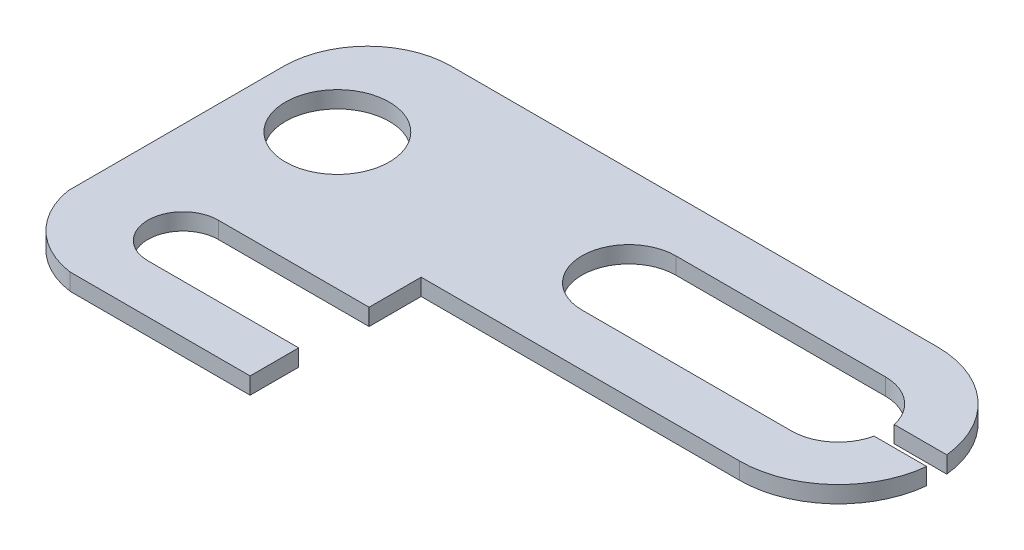
ISO-10303-21;
HEADER;
FILE_DESCRIPTION(('STEP AP214'),'2;1');
FILE_NAME('part.step','',(''),(''),'','','');
FILE_SCHEMA(('AUTOMOTIVE_DESIGN { 1 0 10303 214 1 1 1 1 }'));
ENDSEC;
DATA;
#1=APPLICATION_CONTEXT('core data for automotive mechanical design processes');
#2=APPLICATION_PROTOCOL_DEFINITION('international standard','automotive_design',2000,#1);
#3=PRODUCT_CONTEXT('',#1,'mechanical');
#4=PRODUCT('Part','Part','',(#3));
#5=PRODUCT_RELATED_PRODUCT_CATEGORY('part','',(#4));
#6=PRODUCT_DEFINITION_FORMATION('','',#4);
#7=PRODUCT_DEFINITION_CONTEXT('part definition',#1,'design');
#8=PRODUCT_DEFINITION('design','',#6,#7);
#9=PRODUCT_DEFINITION_SHAPE('','',#8);
#10=(LENGTH_UNIT() NAMED_UNIT(*) SI_UNIT(.MILLI.,.METRE.));
#11=(NAMED_UNIT(*) PLANE_ANGLE_UNIT() SI_UNIT($,.RADIAN.));
#12=(NAMED_UNIT(*) SI_UNIT($,.STERADIAN.) SOLID_ANGLE_UNIT());
#13=UNCERTAINTY_MEASURE_WITH_UNIT(LENGTH_MEASURE(1.E-05),#10,'distance_accuracy_value','');
#14=(GEOMETRIC_REPRESENTATION_CONTEXT(3) GLOBAL_UNCERTAINTY_ASSIGNED_CONTEXT((#13)) GLOBAL_UNIT_ASSIGNED_CONTEXT((#10,
#11,#12)) REPRESENTATION_CONTEXT('',''));
#15=CARTESIAN_POINT('',(0.,0.,0.));
#16=DIRECTION('',(0.,0.,1.));
#17=DIRECTION('',(1.,0.,0.));
#18=AXIS2_PLACEMENT_3D('',#15,#16,#17);
#19=CARTESIAN_POINT('',(-2.5,1.,-0.899999999999999));
#20=DIRECTION('',(0.,1.,0.));
#21=DIRECTION('',(0.,0.,1.));
#22=AXIS2_PLACEMENT_3D('',#19,#20,#21);
#23=PLANE('',#22);
#24=DIRECTION('',(0.,0.,1.));
#25=VECTOR('',#24,1.);
#26=CARTESIAN_POINT('',(7.49999999999999,1.,6.87122336885729));
#27=LINE('',#26,#25);
#28=CARTESIAN_POINT('',(7.49999999999999,0.999999999999991,9.00615156930462));
#29=VERTEX_POINT('',#28);
#30=CARTESIAN_POINT('',(7.49999999999999,1.,5.9));
#31=VERTEX_POINT('',#30);
#32=EDGE_CURVE('E169',#29,#31,#27,.F.);
#33=ORIENTED_EDGE('',*,*,#32,.T.);
#34=DIRECTION('',(1.,0.,0.));
#35=VECTOR('',#34,1.);
#36=CARTESIAN_POINT('',(7.84532386448258,1.,5.9));
#37=LINE('',#36,#35);
#38=CARTESIAN_POINT('',(26.4926856920564,1.00000000000012,5.9));
#39=VERTEX_POINT('',#38);
#40=EDGE_CURVE('E156',#31,#39,#37,.T.);
#41=ORIENTED_EDGE('',*,*,#40,.T.);
#42=CARTESIAN_POINT('',(26.4926856920564,1.00000000000012,0.));
#43=DIRECTION('',(0.,1.,0.));
#44=DIRECTION('',(1.,0.,0.));
#45=AXIS2_PLACEMENT_3D('',#42,#43,#44);
#46=CIRCLE('',#45,5.9);
#47=CARTESIAN_POINT('',(32.3620979283881,1.00000000000015,0.599999999999997));
#48=VERTEX_POINT('',#47);
#49=EDGE_CURVE('E219',#39,#48,#46,.T.);
#50=ORIENTED_EDGE('',*,*,#49,.T.);
#51=DIRECTION('',(1.,0.,0.));
#52=VECTOR('',#51,1.);
#53=CARTESIAN_POINT('',(32.3620979283881,1.00000000000015,0.599999999999997));
#54=LINE('',#53,#52);
#55=CARTESIAN_POINT('',(29.2276445582919,1.00000000000013,0.599999999999997));
#56=VERTEX_POINT('',#55);
#57=EDGE_CURVE('E199',#56,#48,#54,.T.);
#58=ORIENTED_EDGE('',*,*,#57,.F.);
#59=CARTESIAN_POINT('',(26.4926856920564,1.00000000000012,0.));
#60=DIRECTION('',(0.,1.,0.));
#61=DIRECTION('',(-1.,0.,0.));
#62=AXIS2_PLACEMENT_3D('',#59,#60,#61);
#63=CIRCLE('',#62,2.8);
#64=CARTESIAN_POINT('',(26.4926856920564,1.00000000000012,2.8));
#65=VERTEX_POINT('',#64);
#66=EDGE_CURVE('E193',#65,#56,#63,.T.);
#67=ORIENTED_EDGE('',*,*,#66,.F.);
#68=DIRECTION('',(1.,0.,0.));
#69=VECTOR('',#68,1.);
#70=CARTESIAN_POINT('',(26.4926856920564,1.00000000000012,2.8));
#71=LINE('',#70,#69);
#72=CARTESIAN_POINT('',(13.9926856920564,1.00000000000003,2.8));
#73=VERTEX_POINT('',#72);
#74=EDGE_CURVE('E187',#73,#65,#71,.T.);
#75=ORIENTED_EDGE('',*,*,#74,.F.);
#76=CARTESIAN_POINT('',(13.9926856920564,1.00000000000003,0.));
#77=DIRECTION('',(0.,1.,0.));
#78=DIRECTION('',(-1.,0.,0.));
#79=AXIS2_PLACEMENT_3D('',#76,#77,#78);
#80=CIRCLE('',#79,2.8);
#81=CARTESIAN_POINT('',(13.9926856920564,1.00000000000003,-2.8));
#82=VERTEX_POINT('',#81);
#83=EDGE_CURVE('E181',#82,#73,#80,.T.);
#84=ORIENTED_EDGE('',*,*,#83,.F.);
#85=DIRECTION('',(-1.,0.,0.));
#86=VECTOR('',#85,1.);
#87=CARTESIAN_POINT('',(26.4926856920564,1.00000000000012,-2.8));
#88=LINE('',#87,#86);
#89=CARTESIAN_POINT('',(26.4926856920564,1.00000000000012,-2.8));
#90=VERTEX_POINT('',#89);
#91=EDGE_CURVE('E175',#90,#82,#88,.T.);
#92=ORIENTED_EDGE('',*,*,#91,.F.);
#93=CARTESIAN_POINT('',(26.4926856920564,1.00000000000012,0.));
#94=DIRECTION('',(0.,1.,0.));
#95=DIRECTION('',(-1.,0.,0.));
#96=AXIS2_PLACEMENT_3D('',#93,#94,#95);
#97=CIRCLE('',#96,2.8);
#98=CARTESIAN_POINT('',(29.2276445582919,1.00000000000013,-0.600000000000001));
#99=VERTEX_POINT('',#98);
#100=EDGE_CURVE('E168',#99,#90,#97,.T.);
#101=ORIENTED_EDGE('',*,*,#100,.F.);
#102=DIRECTION('',(-1.,0.,0.));
#103=VECTOR('',#102,1.);
#104=CARTESIAN_POINT('',(32.3620979283881,1.00000000000015,-0.600000000000002));
#105=LINE('',#104,#103);
#106=CARTESIAN_POINT('',(32.3620979283881,1.00000000000015,-0.600000000000002));
#107=VERTEX_POINT('',#106);
#108=EDGE_CURVE('E215',#107,#99,#105,.T.);
#109=ORIENTED_EDGE('',*,*,#108,.F.);
#110=CARTESIAN_POINT('',(26.4926856920564,1.00000000000012,-5.9));
#111=VERTEX_POINT('',#110);
#112=EDGE_CURVE('E218',#107,#111,#46,.T.);
#113=ORIENTED_EDGE('',*,*,#112,.T.);
#114=DIRECTION('',(-1.,0.,0.));
#115=VECTOR('',#114,1.);
#116=CARTESIAN_POINT('',(-2.49999999999997,1.,-5.9));
#117=LINE('',#116,#115);
#118=CARTESIAN_POINT('',(-2.49999999999997,1.,-5.9));
#119=VERTEX_POINT('',#118);
#120=EDGE_CURVE('E145',#111,#119,#117,.T.);
#121=ORIENTED_EDGE('',*,*,#120,.T.);
#122=CARTESIAN_POINT('',(-2.5,1.,-0.899999999999999));
#123=DIRECTION('',(0.,1.,0.));
#124=DIRECTION('',(0.,0.,1.));
#125=AXIS2_PLACEMENT_3D('',#122,#123,#124);
#126=CIRCLE('',#125,5.);
#127=CARTESIAN_POINT('',(-7.5,1.,-0.899999999999966));
#128=VERTEX_POINT('',#127);
#129=EDGE_CURVE('E107',#119,#128,#126,.T.);
#130=ORIENTED_EDGE('',*,*,#129,.T.);
#131=DIRECTION('',(0.,0.,1.));
#132=VECTOR('',#131,1.);
#133=CARTESIAN_POINT('',(-7.5,1.,-0.899999999999966));
#134=LINE('',#133,#132);
#135=CARTESIAN_POINT('',(-7.50000000000001,0.999999999999971,11.9741467377146));
#136=VERTEX_POINT('',#135);
#137=EDGE_CURVE('E138',#128,#136,#134,.T.);
#138=ORIENTED_EDGE('',*,*,#137,.T.);
#139=CARTESIAN_POINT('',(-2.56821468143076,0.999999999999977,11.1510467610745));
#140=DIRECTION('',(0.,-1.,0.));
#141=DIRECTION('',(0.,0.,-1.));
#142=AXIS2_PLACEMENT_3D('',#139,#140,#141);
#143=CIRCLE('',#142,5.);
#144=CARTESIAN_POINT('',(-3.23900316634077,0.999999999999943,16.1058467377146));
#145=VERTEX_POINT('',#144);
#146=EDGE_CURVE('E288',#145,#136,#143,.T.);
#147=ORIENTED_EDGE('',*,*,#146,.F.);
#148=DIRECTION('',(-1.,0.,0.));
#149=VECTOR('',#148,1.);
#150=CARTESIAN_POINT('',(0.,0.999999999999943,16.1058467377146));
#151=LINE('',#150,#149);
#152=CARTESIAN_POINT('',(7.49999999999999,0.999999999999943,16.1058467377146));
#153=VERTEX_POINT('',#152);
#154=EDGE_CURVE('E309',#145,#153,#151,.F.);
#155=ORIENTED_EDGE('',*,*,#154,.T.);
#156=DIRECTION('',(0.,0.,1.));
#157=VECTOR('',#156,1.);
#158=CARTESIAN_POINT('',(7.49999999999999,1.00000000000001,6.10584673771456));
#159=LINE('',#158,#157);
#160=CARTESIAN_POINT('',(7.49999999999999,0.999999999999963,13.2055419061245));
#161=VERTEX_POINT('',#160);
#162=EDGE_CURVE('E312',#153,#161,#159,.F.);
#163=ORIENTED_EDGE('',*,*,#162,.T.);
#164=CARTESIAN_POINT('',(7.46422012079584,0.999999999999977,11.1058467377146));
#165=DIRECTION('',(0.,1.,0.));
#166=DIRECTION('',(0.,0.,1.));
#167=AXIS2_PLACEMENT_3D('',#164,#165,#166);
#168=CIRCLE('',#167,2.1);
#169=CARTESIAN_POINT('',(7.46422012079584,0.999999999999963,13.2058467377146));
#170=VERTEX_POINT('',#169);
#171=EDGE_CURVE('E274',#170,#161,#168,.T.);
#172=ORIENTED_EDGE('',*,*,#171,.F.);
#173=DIRECTION('',(1.,0.,0.));
#174=VECTOR('',#173,1.);
#175=CARTESIAN_POINT('',(7.46422012079584,0.999999999999963,13.2058467377146));
#176=LINE('',#175,#174);
#177=CARTESIAN_POINT('',(-1.49864165623725,0.999999999999963,13.2058467377146));
#178=VERTEX_POINT('',#177);
#179=EDGE_CURVE('E264',#178,#170,#176,.T.);
#180=ORIENTED_EDGE('',*,*,#179,.F.);
#181=CARTESIAN_POINT('',(-1.49864165623725,0.999999999999977,11.1058467377146));
#182=DIRECTION('',(0.,1.,0.));
#183=DIRECTION('',(0.,0.,1.));
#184=AXIS2_PLACEMENT_3D('',#181,#182,#183);
#185=CIRCLE('',#184,2.1);
#186=CARTESIAN_POINT('',(-1.49864165623725,0.999999999999991,9.00584673771459));
#187=VERTEX_POINT('',#186);
#188=EDGE_CURVE('E255',#187,#178,#185,.T.);
#189=ORIENTED_EDGE('',*,*,#188,.F.);
#190=DIRECTION('',(-1.,0.,0.));
#191=VECTOR('',#190,1.);
#192=CARTESIAN_POINT('',(7.46422012079584,0.999999999999991,9.00584673771459));
#193=LINE('',#192,#191);
#194=CARTESIAN_POINT('',(7.46422012079584,0.999999999999991,9.00584673771459));
#195=VERTEX_POINT('',#194);
#196=EDGE_CURVE('E303',#195,#187,#193,.T.);
#197=ORIENTED_EDGE('',*,*,#196,.F.);
#198=CARTESIAN_POINT('',(7.46422012079584,0.999999999999977,11.1058467377146));
#199=DIRECTION('',(0.,-1.,0.));
#200=DIRECTION('',(0.,0.,-1.));
#201=AXIS2_PLACEMENT_3D('',#198,#199,#200);
#202=CIRCLE('',#201,2.1);
#203=EDGE_CURVE('E306',#195,#29,#202,.T.);
#204=ORIENTED_EDGE('',*,*,#203,.T.);
#205=EDGE_LOOP('',(#33,#41,#50,#58,#67,#75,#84,#92,#101,#109,#113,#121,#130,#138,#147,#155,#163,
#172,#180,#189,#197,#204));
#206=FACE_BOUND('',#205,.T.);
#207=CARTESIAN_POINT('',(-2.5,1.,0.9));
#208=DIRECTION('',(0.,1.,0.));
#209=DIRECTION('',(0.,0.,1.));
#210=AXIS2_PLACEMENT_3D('',#207,#208,#209);
#211=CIRCLE('',#210,3.1);
#212=CARTESIAN_POINT('',(-2.5,1.,4.));
#213=VERTEX_POINT('',#212);
#214=EDGE_CURVE('E150',#213,#213,#211,.T.);
#215=ORIENTED_EDGE('',*,*,#214,.F.);
#216=EDGE_LOOP('',(#215));
#217=FACE_BOUND('',#216,.T.);
#218=ADVANCED_FACE('F83',(#206,#217),#23,.T.);
#219=CARTESIAN_POINT('',(-2.5,0.,-0.899999999999999));
#220=DIRECTION('',(0.,1.,0.));
#221=DIRECTION('',(0.,0.,1.));
#222=AXIS2_PLACEMENT_3D('',#219,#220,#221);
#223=PLANE('',#222);
#224=DIRECTION('',(-1.,0.,0.));
#225=VECTOR('',#224,1.);
#226=CARTESIAN_POINT('',(-2.49999999999997,0.,-5.9));
#227=LINE('',#226,#225);
#228=CARTESIAN_POINT('',(26.4926856920564,1.21430643318376E-13,-5.9));
#229=VERTEX_POINT('',#228);
#230=CARTESIAN_POINT('',(-2.49999999999997,0.,-5.9));
#231=VERTEX_POINT('',#230);
#232=EDGE_CURVE('E130',#229,#231,#227,.T.);
#233=ORIENTED_EDGE('',*,*,#232,.F.);
#234=CARTESIAN_POINT('',(26.4926856920564,1.16226472890446E-13,0.));
#235=DIRECTION('',(0.,1.,0.));
#236=DIRECTION('',(1.,0.,0.));
#237=AXIS2_PLACEMENT_3D('',#234,#235,#236);
#238=CIRCLE('',#237,5.9);
#239=CARTESIAN_POINT('',(32.3620979283881,1.52655665885959E-13,-0.600000000000003));
#240=VERTEX_POINT('',#239);
#241=EDGE_CURVE('E211',#240,#229,#238,.T.);
#242=ORIENTED_EDGE('',*,*,#241,.F.);
#243=DIRECTION('',(-1.,0.,0.));
#244=VECTOR('',#243,1.);
#245=CARTESIAN_POINT('',(1.61907035664203,0.,-0.599999999999995));
#246=LINE('',#245,#244);
#247=CARTESIAN_POINT('',(29.2276445582919,1.40512601554121E-13,-0.600000000000001));
#248=VERTEX_POINT('',#247);
#249=EDGE_CURVE('E222',#240,#248,#246,.T.);
#250=ORIENTED_EDGE('',*,*,#249,.T.);
#251=CARTESIAN_POINT('',(26.4926856920564,1.23165366794353E-13,0.));
#252=DIRECTION('',(0.,1.,0.));
#253=DIRECTION('',(-1.,0.,0.));
#254=AXIS2_PLACEMENT_3D('',#251,#252,#253);
#255=CIRCLE('',#254,2.8);
#256=CARTESIAN_POINT('',(26.4926856920564,1.23165366794353E-13,-2.8));
#257=VERTEX_POINT('',#256);
#258=EDGE_CURVE('E225',#248,#257,#255,.T.);
#259=ORIENTED_EDGE('',*,*,#258,.T.);
#260=DIRECTION('',(-1.,0.,0.));
#261=VECTOR('',#260,1.);
#262=CARTESIAN_POINT('',(1.61907035664203,0.,-2.8));
#263=LINE('',#262,#261);
#264=CARTESIAN_POINT('',(13.9926856920564,0.,-2.8));
#265=VERTEX_POINT('',#264);
#266=EDGE_CURVE('E228',#257,#265,#263,.T.);
#267=ORIENTED_EDGE('',*,*,#266,.T.);
#268=CARTESIAN_POINT('',(13.9926856920564,0.,0.));
#269=DIRECTION('',(0.,1.,0.));
#270=DIRECTION('',(-1.,0.,0.));
#271=AXIS2_PLACEMENT_3D('',#268,#269,#270);
#272=CIRCLE('',#271,2.8);
#273=CARTESIAN_POINT('',(13.9926856920564,0.,2.8));
#274=VERTEX_POINT('',#273);
#275=EDGE_CURVE('E231',#265,#274,#272,.T.);
#276=ORIENTED_EDGE('',*,*,#275,.T.);
#277=DIRECTION('',(1.,0.,0.));
#278=VECTOR('',#277,1.);
#279=CARTESIAN_POINT('',(1.61907035664203,0.,2.8));
#280=LINE('',#279,#278);
#281=CARTESIAN_POINT('',(26.4926856920564,1.196959198424E-13,2.8));
#282=VERTEX_POINT('',#281);
#283=EDGE_CURVE('E234',#274,#282,#280,.T.);
#284=ORIENTED_EDGE('',*,*,#283,.T.);
#285=CARTESIAN_POINT('',(26.4926856920564,1.23165366794353E-13,0.));
#286=DIRECTION('',(0.,1.,0.));
#287=DIRECTION('',(-1.,0.,0.));
#288=AXIS2_PLACEMENT_3D('',#285,#286,#287);
#289=CIRCLE('',#288,2.8);
#290=CARTESIAN_POINT('',(29.2276445582919,1.40512601554121E-13,0.599999999999997));
#291=VERTEX_POINT('',#290);
#292=EDGE_CURVE('E237',#282,#291,#289,.T.);
#293=ORIENTED_EDGE('',*,*,#292,.T.);
#294=DIRECTION('',(1.,0.,0.));
#295=VECTOR('',#294,1.);
#296=CARTESIAN_POINT('',(1.61907035664203,0.,0.599999999999996));
#297=LINE('',#296,#295);
#298=CARTESIAN_POINT('',(32.3620979283881,1.52655665885959E-13,0.599999999999998));
#299=VERTEX_POINT('',#298);
#300=EDGE_CURVE('E240',#291,#299,#297,.T.);
#301=ORIENTED_EDGE('',*,*,#300,.T.);
#302=CARTESIAN_POINT('',(26.4926856920564,1.17961196366423E-13,5.9));
#303=VERTEX_POINT('',#302);
#304=EDGE_CURVE('E208',#303,#299,#238,.T.);
#305=ORIENTED_EDGE('',*,*,#304,.F.);
#306=DIRECTION('',(1.,0.,0.));
#307=VECTOR('',#306,1.);
#308=CARTESIAN_POINT('',(7.84532386448258,0.,5.9));
#309=LINE('',#308,#307);
#310=CARTESIAN_POINT('',(7.49999999999999,0.,5.9));
#311=VERTEX_POINT('',#310);
#312=EDGE_CURVE('E159',#311,#303,#309,.T.);
#313=ORIENTED_EDGE('',*,*,#312,.F.);
#314=DIRECTION('',(0.,0.,1.));
#315=VECTOR('',#314,1.);
#316=CARTESIAN_POINT('',(7.49999999999999,0.,6.87122336885729));
#317=LINE('',#316,#315);
#318=CARTESIAN_POINT('',(7.49999999999999,0.,9.00615156930462));
#319=VERTEX_POINT('',#318);
#320=EDGE_CURVE('E98',#319,#311,#317,.F.);
#321=ORIENTED_EDGE('',*,*,#320,.F.);
#322=CARTESIAN_POINT('',(7.46422012079584,0.,11.1058467377146));
#323=DIRECTION('',(0.,-1.,0.));
#324=DIRECTION('',(0.,0.,-1.));
#325=AXIS2_PLACEMENT_3D('',#322,#323,#324);
#326=CIRCLE('',#325,2.1);
#327=CARTESIAN_POINT('',(7.46422012079584,0.,9.00584673771458));
#328=VERTEX_POINT('',#327);
#329=EDGE_CURVE('E294',#328,#319,#326,.T.);
#330=ORIENTED_EDGE('',*,*,#329,.F.);
#331=DIRECTION('',(1.,0.,0.));
#332=VECTOR('',#331,1.);
#333=CARTESIAN_POINT('',(0.,0.,9.00584673771458));
#334=LINE('',#333,#332);
#335=CARTESIAN_POINT('',(-1.49864165623725,0.,9.00584673771458));
#336=VERTEX_POINT('',#335);
#337=EDGE_CURVE('E297',#336,#328,#334,.T.);
#338=ORIENTED_EDGE('',*,*,#337,.F.);
#339=CARTESIAN_POINT('',(-1.49864165623725,0.,11.1058467377146));
#340=DIRECTION('',(0.,-1.,0.));
#341=DIRECTION('',(0.,0.,-1.));
#342=AXIS2_PLACEMENT_3D('',#339,#340,#341);
#343=CIRCLE('',#342,2.1);
#344=CARTESIAN_POINT('',(-1.49864165623725,0.,13.2058467377146));
#345=VERTEX_POINT('',#344);
#346=EDGE_CURVE('E249',#345,#336,#343,.T.);
#347=ORIENTED_EDGE('',*,*,#346,.F.);
#348=DIRECTION('',(-1.,0.,0.));
#349=VECTOR('',#348,1.);
#350=CARTESIAN_POINT('',(0.,0.,13.2058467377146));
#351=LINE('',#350,#349);
#352=CARTESIAN_POINT('',(7.46422012079584,0.,13.2058467377146));
#353=VERTEX_POINT('',#352);
#354=EDGE_CURVE('E258',#353,#345,#351,.T.);
#355=ORIENTED_EDGE('',*,*,#354,.F.);
#356=CARTESIAN_POINT('',(7.49999999999999,0.,13.2055419061245));
#357=VERTEX_POINT('',#356);
#358=EDGE_CURVE('E270',#357,#353,#326,.T.);
#359=ORIENTED_EDGE('',*,*,#358,.F.);
#360=DIRECTION('',(0.,0.,-1.));
#361=VECTOR('',#360,1.);
#362=CARTESIAN_POINT('',(7.49999999999999,0.,7.10584673771458));
#363=LINE('',#362,#361);
#364=CARTESIAN_POINT('',(7.49999999999999,0.,16.1058467377146));
#365=VERTEX_POINT('',#364);
#366=EDGE_CURVE('E277',#365,#357,#363,.T.);
#367=ORIENTED_EDGE('',*,*,#366,.F.);
#368=DIRECTION('',(1.,0.,0.));
#369=VECTOR('',#368,1.);
#370=CARTESIAN_POINT('',(7.49999999999999,0.,16.1058467377146));
#371=LINE('',#370,#369);
#372=CARTESIAN_POINT('',(-3.23900316634076,0.,16.1058467377146));
#373=VERTEX_POINT('',#372);
#374=EDGE_CURVE('E278',#373,#365,#371,.T.);
#375=ORIENTED_EDGE('',*,*,#374,.F.);
#376=CARTESIAN_POINT('',(-2.56821468143076,0.,11.1510467610745));
#377=DIRECTION('',(0.,-1.,0.));
#378=DIRECTION('',(0.,0.,-1.));
#379=AXIS2_PLACEMENT_3D('',#376,#377,#378);
#380=CIRCLE('',#379,5.);
#381=CARTESIAN_POINT('',(-7.50000000000001,0.,11.9741467377146));
#382=VERTEX_POINT('',#381);
#383=EDGE_CURVE('E144',#382,#373,#380,.F.);
#384=ORIENTED_EDGE('',*,*,#383,.F.);
#385=DIRECTION('',(0.,0.,1.));
#386=VECTOR('',#385,1.);
#387=CARTESIAN_POINT('',(-7.5,0.,-0.899999999999966));
#388=LINE('',#387,#386);
#389=CARTESIAN_POINT('',(-7.5,0.,-0.899999999999966));
#390=VERTEX_POINT('',#389);
#391=EDGE_CURVE('E129',#390,#382,#388,.T.);
#392=ORIENTED_EDGE('',*,*,#391,.F.);
#393=CARTESIAN_POINT('',(-2.5,0.,-0.899999999999999));
#394=DIRECTION('',(0.,1.,0.));
#395=DIRECTION('',(0.,0.,1.));
#396=AXIS2_PLACEMENT_3D('',#393,#394,#395);
#397=CIRCLE('',#396,5.);
#398=EDGE_CURVE('E120',#231,#390,#397,.T.);
#399=ORIENTED_EDGE('',*,*,#398,.F.);
#400=EDGE_LOOP('',(#233,#242,#250,#259,#267,#276,#284,#293,#301,#305,#313,#321,#330,#338,#347,
#355,#359,#367,#375,#384,#392,#399));
#401=FACE_BOUND('',#400,.T.);
#402=CARTESIAN_POINT('',(-2.5,0.,0.9));
#403=DIRECTION('',(0.,1.,0.));
#404=DIRECTION('',(0.,0.,1.));
#405=AXIS2_PLACEMENT_3D('',#402,#403,#404);
#406=CIRCLE('',#405,3.1);
#407=CARTESIAN_POINT('',(-2.5,0.,4.));
#408=VERTEX_POINT('',#407);
#409=EDGE_CURVE('E153',#408,#408,#406,.T.);
#410=ORIENTED_EDGE('',*,*,#409,.T.);
#411=EDGE_LOOP('',(#410));
#412=FACE_BOUND('',#411,.T.);
#413=ADVANCED_FACE('F85',(#401,#412),#223,.F.);
#414=CARTESIAN_POINT('',(-2.49999999999997,1.,-5.9));
#415=DIRECTION('',(0.,0.,1.));
#416=DIRECTION('',(1.,0.,0.));
#417=AXIS2_PLACEMENT_3D('',#414,#415,#416);
#418=PLANE('',#417);
#419=ORIENTED_EDGE('',*,*,#232,.T.);
#420=DIRECTION('',(0.,-1.,0.));
#421=VECTOR('',#420,1.);
#422=CARTESIAN_POINT('',(-2.49999999999997,1.,-5.9));
#423=LINE('',#422,#421);
#424=EDGE_CURVE('E91',#119,#231,#423,.T.);
#425=ORIENTED_EDGE('',*,*,#424,.F.);
#426=ORIENTED_EDGE('',*,*,#120,.F.);
#427=DIRECTION('',(0.,-1.,0.));
#428=VECTOR('',#427,1.);
#429=CARTESIAN_POINT('',(26.4926856920564,1.00000000000012,-5.9));
#430=LINE('',#429,#428);
#431=EDGE_CURVE('E162',#111,#229,#430,.T.);
#432=ORIENTED_EDGE('',*,*,#431,.T.);
#433=EDGE_LOOP('',(#419,#425,#426,#432));
#434=FACE_BOUND('',#433,.T.);
#435=ADVANCED_FACE('F422',(#434),#418,.F.);
#436=CARTESIAN_POINT('',(-2.5,1.,-0.899999999999999));
#437=DIRECTION('',(0.,-1.,0.));
#438=DIRECTION('',(0.,0.,-1.));
#439=AXIS2_PLACEMENT_3D('',#436,#437,#438);
#440=CYLINDRICAL_SURFACE('',#439,5.);
#441=ORIENTED_EDGE('',*,*,#398,.T.);
#442=DIRECTION('',(0.,-1.,0.));
#443=VECTOR('',#442,1.);
#444=CARTESIAN_POINT('',(-7.5,1.,-0.899999999999966));
#445=LINE('',#444,#443);
#446=EDGE_CURVE('E123',#128,#390,#445,.T.);
#447=ORIENTED_EDGE('',*,*,#446,.F.);
#448=ORIENTED_EDGE('',*,*,#129,.F.);
#449=ORIENTED_EDGE('',*,*,#424,.T.);
#450=EDGE_LOOP('',(#441,#447,#448,#449));
#451=FACE_BOUND('',#450,.T.);
#452=ADVANCED_FACE('F122',(#451),#440,.T.);
#453=CARTESIAN_POINT('',(-7.5,1.,-0.899999999999966));
#454=DIRECTION('',(1.,0.,0.));
#455=DIRECTION('',(0.,0.,-1.));
#456=AXIS2_PLACEMENT_3D('',#453,#454,#455);
#457=PLANE('',#456);
#458=ORIENTED_EDGE('',*,*,#391,.T.);
#459=DIRECTION('',(0.,1.,0.));
#460=VECTOR('',#459,1.);
#461=CARTESIAN_POINT('',(-7.50000000000001,-9.00000000000003,11.9741467377145));
#462=LINE('',#461,#460);
#463=EDGE_CURVE('E246',#382,#136,#462,.T.);
#464=ORIENTED_EDGE('',*,*,#463,.T.);
#465=ORIENTED_EDGE('',*,*,#137,.F.);
#466=ORIENTED_EDGE('',*,*,#446,.T.);
#467=EDGE_LOOP('',(#458,#464,#465,#466));
#468=FACE_BOUND('',#467,.T.);
#469=ADVANCED_FACE('F134',(#468),#457,.F.);
#470=CARTESIAN_POINT('',(-2.5,1.,0.9));
#471=DIRECTION('',(0.,-1.,0.));
#472=DIRECTION('',(0.,0.,-1.));
#473=AXIS2_PLACEMENT_3D('',#470,#471,#472);
#474=CYLINDRICAL_SURFACE('',#473,3.1);
#475=ORIENTED_EDGE('',*,*,#214,.T.);
#476=EDGE_LOOP('',(#475));
#477=FACE_BOUND('',#476,.T.);
#478=ORIENTED_EDGE('',*,*,#409,.F.);
#479=EDGE_LOOP('',(#478));
#480=FACE_BOUND('',#479,.T.);
#481=ADVANCED_FACE('F435',(#477,#480),#474,.F.);
#482=CARTESIAN_POINT('',(7.84532386448258,0.5,5.9));
#483=DIRECTION('',(0.,0.,1.));
#484=DIRECTION('',(1.,0.,0.));
#485=AXIS2_PLACEMENT_3D('',#482,#483,#484);
#486=PLANE('',#485);
#487=DIRECTION('',(0.,-1.,0.));
#488=VECTOR('',#487,1.);
#489=CARTESIAN_POINT('',(7.49999999999999,1.,5.9));
#490=LINE('',#489,#488);
#491=EDGE_CURVE('E13',#31,#311,#490,.T.);
#492=ORIENTED_EDGE('',*,*,#491,.T.);
#493=ORIENTED_EDGE('',*,*,#312,.T.);
#494=DIRECTION('',(0.,-1.,0.));
#495=VECTOR('',#494,1.);
#496=CARTESIAN_POINT('',(26.4926856920564,1.00000000000012,5.9));
#497=LINE('',#496,#495);
#498=EDGE_CURVE('E205',#39,#303,#497,.T.);
#499=ORIENTED_EDGE('',*,*,#498,.F.);
#500=ORIENTED_EDGE('',*,*,#40,.F.);
#501=EDGE_LOOP('',(#492,#493,#499,#500));
#502=FACE_BOUND('',#501,.T.);
#503=ADVANCED_FACE('F441',(#502),#486,.T.);
#504=CARTESIAN_POINT('',(26.4926856920565,-8.99999999999988,0.));
#505=DIRECTION('',(0.,1.,0.));
#506=DIRECTION('',(-1.,0.,0.));
#507=AXIS2_PLACEMENT_3D('',#504,#505,#506);
#508=CYLINDRICAL_SURFACE('',#507,2.8);
#509=DIRECTION('',(0.,1.,0.));
#510=VECTOR('',#509,1.);
#511=CARTESIAN_POINT('',(29.227644558292,-8.99999999999986,-0.600000000000003));
#512=LINE('',#511,#510);
#513=EDGE_CURVE('E165',#248,#99,#512,.T.);
#514=ORIENTED_EDGE('',*,*,#513,.T.);
#515=ORIENTED_EDGE('',*,*,#100,.T.);
#516=DIRECTION('',(0.,1.,0.));
#517=VECTOR('',#516,1.);
#518=CARTESIAN_POINT('',(26.4926856920565,-8.99999999999988,-2.8));
#519=LINE('',#518,#517);
#520=EDGE_CURVE('E172',#257,#90,#519,.T.);
#521=ORIENTED_EDGE('',*,*,#520,.F.);
#522=ORIENTED_EDGE('',*,*,#258,.F.);
#523=EDGE_LOOP('',(#514,#515,#521,#522));
#524=FACE_BOUND('',#523,.T.);
#525=ADVANCED_FACE('F400',(#524),#508,.F.);
#526=CARTESIAN_POINT('',(26.4926856920565,-8.99999999999988,-2.8));
#527=DIRECTION('',(0.,0.,-1.));
#528=DIRECTION('',(-0.529919264233207,0.848048096156425,0.));
#529=AXIS2_PLACEMENT_3D('',#526,#527,#528);
#530=PLANE('',#529);
#531=ORIENTED_EDGE('',*,*,#520,.T.);
#532=ORIENTED_EDGE('',*,*,#91,.T.);
#533=DIRECTION('',(0.,1.,0.));
#534=VECTOR('',#533,1.);
#535=CARTESIAN_POINT('',(13.9926856920565,-8.99999999999997,-2.8));
#536=LINE('',#535,#534);
#537=EDGE_CURVE('E178',#265,#82,#536,.T.);
#538=ORIENTED_EDGE('',*,*,#537,.F.);
#539=ORIENTED_EDGE('',*,*,#266,.F.);
#540=EDGE_LOOP('',(#531,#532,#538,#539));
#541=FACE_BOUND('',#540,.T.);
#542=ADVANCED_FACE('F415',(#541),#530,.F.);
#543=CARTESIAN_POINT('',(13.9926856920565,-8.99999999999997,0.));
#544=DIRECTION('',(0.,1.,0.));
#545=DIRECTION('',(-1.,0.,0.));
#546=AXIS2_PLACEMENT_3D('',#543,#544,#545);
#547=CYLINDRICAL_SURFACE('',#546,2.8);
#548=ORIENTED_EDGE('',*,*,#537,.T.);
#549=ORIENTED_EDGE('',*,*,#83,.T.);
#550=DIRECTION('',(0.,1.,0.));
#551=VECTOR('',#550,1.);
#552=CARTESIAN_POINT('',(13.9926856920565,-8.99999999999997,2.8));
#553=LINE('',#552,#551);
#554=EDGE_CURVE('E184',#274,#73,#553,.T.);
#555=ORIENTED_EDGE('',*,*,#554,.F.);
#556=ORIENTED_EDGE('',*,*,#275,.F.);
#557=EDGE_LOOP('',(#548,#549,#555,#556));
#558=FACE_BOUND('',#557,.T.);
#559=ADVANCED_FACE('F473',(#558),#547,.F.);
#560=CARTESIAN_POINT('',(26.4926856920565,-8.99999999999988,2.8));
#561=DIRECTION('',(0.,0.,1.));
#562=DIRECTION('',(0.529919264233207,-0.848048096156425,0.));
#563=AXIS2_PLACEMENT_3D('',#560,#561,#562);
#564=PLANE('',#563);
#565=ORIENTED_EDGE('',*,*,#554,.T.);
#566=ORIENTED_EDGE('',*,*,#74,.T.);
#567=DIRECTION('',(0.,1.,0.));
#568=VECTOR('',#567,1.);
#569=CARTESIAN_POINT('',(26.4926856920565,-8.99999999999988,2.8));
#570=LINE('',#569,#568);
#571=EDGE_CURVE('E190',#282,#65,#570,.T.);
#572=ORIENTED_EDGE('',*,*,#571,.F.);
#573=ORIENTED_EDGE('',*,*,#283,.F.);
#574=EDGE_LOOP('',(#565,#566,#572,#573));
#575=FACE_BOUND('',#574,.T.);
#576=ADVANCED_FACE('F469',(#575),#564,.F.);
#577=CARTESIAN_POINT('',(26.4926856920565,-8.99999999999988,0.));
#578=DIRECTION('',(0.,1.,0.));
#579=DIRECTION('',(-1.,0.,0.));
#580=AXIS2_PLACEMENT_3D('',#577,#578,#579);
#581=CYLINDRICAL_SURFACE('',#580,2.8);
#582=ORIENTED_EDGE('',*,*,#571,.T.);
#583=ORIENTED_EDGE('',*,*,#66,.T.);
#584=DIRECTION('',(0.,1.,0.));
#585=VECTOR('',#584,1.);
#586=CARTESIAN_POINT('',(29.227644558292,-8.99999999999986,0.599999999999995));
#587=LINE('',#586,#585);
#588=EDGE_CURVE('E196',#291,#56,#587,.T.);
#589=ORIENTED_EDGE('',*,*,#588,.F.);
#590=ORIENTED_EDGE('',*,*,#292,.F.);
#591=EDGE_LOOP('',(#582,#583,#589,#590));
#592=FACE_BOUND('',#591,.T.);
#593=ADVANCED_FACE('F465',(#592),#581,.F.);
#594=CARTESIAN_POINT('',(32.3620979283882,-8.99999999999985,0.599999999999996));
#595=DIRECTION('',(0.,0.,1.));
#596=DIRECTION('',(0.529919264233207,-0.848048096156425,0.));
#597=AXIS2_PLACEMENT_3D('',#594,#595,#596);
#598=PLANE('',#597);
#599=ORIENTED_EDGE('',*,*,#588,.T.);
#600=ORIENTED_EDGE('',*,*,#57,.T.);
#601=DIRECTION('',(0.,1.,0.));
#602=VECTOR('',#601,1.);
#603=CARTESIAN_POINT('',(32.3620979283881,1.54390389361936E-13,0.599999999999997));
#604=LINE('',#603,#602);
#605=EDGE_CURVE('E202',#48,#299,#604,.F.);
#606=ORIENTED_EDGE('',*,*,#605,.T.);
#607=ORIENTED_EDGE('',*,*,#300,.F.);
#608=EDGE_LOOP('',(#599,#600,#606,#607));
#609=FACE_BOUND('',#608,.T.);
#610=ADVANCED_FACE('F461',(#609),#598,.F.);
#611=CARTESIAN_POINT('',(26.4926856920564,1.16226472890446E-13,0.));
#612=DIRECTION('',(0.,1.,0.));
#613=DIRECTION('',(-1.,0.,0.));
#614=AXIS2_PLACEMENT_3D('',#611,#612,#613);
#615=CYLINDRICAL_SURFACE('',#614,5.9);
#616=ORIENTED_EDGE('',*,*,#605,.F.);
#617=ORIENTED_EDGE('',*,*,#49,.F.);
#618=ORIENTED_EDGE('',*,*,#498,.T.);
#619=ORIENTED_EDGE('',*,*,#304,.T.);
#620=EDGE_LOOP('',(#616,#617,#618,#619));
#621=FACE_BOUND('',#620,.T.);
#622=ADVANCED_FACE('F458',(#621),#615,.T.);
#623=DIRECTION('',(0.,1.,0.));
#624=VECTOR('',#623,1.);
#625=CARTESIAN_POINT('',(32.3620979283881,1.54390389361936E-13,-0.600000000000003));
#626=LINE('',#625,#624);
#627=EDGE_CURVE('E212',#240,#107,#626,.T.);
#628=ORIENTED_EDGE('',*,*,#627,.F.);
#629=ORIENTED_EDGE('',*,*,#241,.T.);
#630=ORIENTED_EDGE('',*,*,#431,.F.);
#631=ORIENTED_EDGE('',*,*,#112,.F.);
#632=EDGE_LOOP('',(#628,#629,#630,#631));
#633=FACE_BOUND('',#632,.T.);
#634=ADVANCED_FACE('F419',(#633),#615,.T.);
#635=CARTESIAN_POINT('',(32.3620979283882,-8.99999999999985,-0.600000000000004));
#636=DIRECTION('',(0.,0.,-1.));
#637=DIRECTION('',(-0.529919264233207,0.848048096156425,0.));
#638=AXIS2_PLACEMENT_3D('',#635,#636,#637);
#639=PLANE('',#638);
#640=ORIENTED_EDGE('',*,*,#627,.T.);
#641=ORIENTED_EDGE('',*,*,#108,.T.);
#642=ORIENTED_EDGE('',*,*,#513,.F.);
#643=ORIENTED_EDGE('',*,*,#249,.F.);
#644=EDGE_LOOP('',(#640,#641,#642,#643));
#645=FACE_BOUND('',#644,.T.);
#646=ADVANCED_FACE('F406',(#645),#639,.F.);
#647=CARTESIAN_POINT('',(7.49999999999999,0.5,6.87122336885729));
#648=DIRECTION('',(-1.,0.,0.));
#649=DIRECTION('',(0.,0.,1.));
#650=AXIS2_PLACEMENT_3D('',#647,#648,#649);
#651=PLANE('',#650);
#652=ORIENTED_EDGE('',*,*,#320,.T.);
#653=ORIENTED_EDGE('',*,*,#491,.F.);
#654=ORIENTED_EDGE('',*,*,#32,.F.);
#655=DIRECTION('',(0.,1.,0.));
#656=VECTOR('',#655,1.);
#657=CARTESIAN_POINT('',(7.49999999999999,-9.00000000000001,9.00615156930455));
#658=LINE('',#657,#656);
#659=EDGE_CURVE('E291',#319,#29,#658,.T.);
#660=ORIENTED_EDGE('',*,*,#659,.F.);
#661=EDGE_LOOP('',(#652,#653,#654,#660));
#662=FACE_BOUND('',#661,.T.);
#663=ADVANCED_FACE('F457',(#662),#651,.F.);
#664=CARTESIAN_POINT('',(-1.49864165623725,-9.00000000000002,11.1058467377145));
#665=DIRECTION('',(0.,1.,0.));
#666=DIRECTION('',(0.,0.,1.));
#667=AXIS2_PLACEMENT_3D('',#664,#665,#666);
#668=CYLINDRICAL_SURFACE('',#667,2.1);
#669=ORIENTED_EDGE('',*,*,#346,.T.);
#670=DIRECTION('',(0.,1.,0.));
#671=VECTOR('',#670,1.);
#672=CARTESIAN_POINT('',(-1.49864165623725,-9.00000000000001,9.00584673771452));
#673=LINE('',#672,#671);
#674=EDGE_CURVE('E252',#336,#187,#673,.T.);
#675=ORIENTED_EDGE('',*,*,#674,.T.);
#676=ORIENTED_EDGE('',*,*,#188,.T.);
#677=DIRECTION('',(0.,1.,0.));
#678=VECTOR('',#677,1.);
#679=CARTESIAN_POINT('',(-1.49864165623725,-9.00000000000004,13.2058467377145));
#680=LINE('',#679,#678);
#681=EDGE_CURVE('E261',#345,#178,#680,.T.);
#682=ORIENTED_EDGE('',*,*,#681,.F.);
#683=EDGE_LOOP('',(#669,#675,#676,#682));
#684=FACE_BOUND('',#683,.T.);
#685=ADVANCED_FACE('F482',(#684),#668,.F.);
#686=CARTESIAN_POINT('',(7.46422012079584,-9.00000000000004,13.2058467377145));
#687=DIRECTION('',(0.,0.,1.));
#688=DIRECTION('',(0.,-1.,0.));
#689=AXIS2_PLACEMENT_3D('',#686,#687,#688);
#690=PLANE('',#689);
#691=ORIENTED_EDGE('',*,*,#354,.T.);
#692=ORIENTED_EDGE('',*,*,#681,.T.);
#693=ORIENTED_EDGE('',*,*,#179,.T.);
#694=DIRECTION('',(0.,1.,0.));
#695=VECTOR('',#694,1.);
#696=CARTESIAN_POINT('',(7.46422012079584,-9.00000000000004,13.2058467377145));
#697=LINE('',#696,#695);
#698=EDGE_CURVE('E271',#353,#170,#697,.T.);
#699=ORIENTED_EDGE('',*,*,#698,.F.);
#700=EDGE_LOOP('',(#691,#692,#693,#699));
#701=FACE_BOUND('',#700,.T.);
#702=ADVANCED_FACE('F500',(#701),#690,.F.);
#703=CARTESIAN_POINT('',(7.46422012079584,-9.00000000000002,11.1058467377145));
#704=DIRECTION('',(0.,1.,0.));
#705=DIRECTION('',(0.,0.,1.));
#706=AXIS2_PLACEMENT_3D('',#703,#704,#705);
#707=CYLINDRICAL_SURFACE('',#706,2.1);
#708=DIRECTION('',(0.,1.,0.));
#709=VECTOR('',#708,1.);
#710=CARTESIAN_POINT('',(7.49999999999999,-9.00000000000004,13.2055419061245));
#711=LINE('',#710,#709);
#712=EDGE_CURVE('E267',#161,#357,#711,.F.);
#713=ORIENTED_EDGE('',*,*,#712,.T.);
#714=ORIENTED_EDGE('',*,*,#358,.T.);
#715=ORIENTED_EDGE('',*,*,#698,.T.);
#716=ORIENTED_EDGE('',*,*,#171,.T.);
#717=EDGE_LOOP('',(#713,#714,#715,#716));
#718=FACE_BOUND('',#717,.T.);
#719=ADVANCED_FACE('F497',(#718),#707,.F.);
#720=CARTESIAN_POINT('',(7.49999999999999,0.,7.10584673771458));
#721=DIRECTION('',(1.,0.,0.));
#722=DIRECTION('',(0.,1.,0.));
#723=AXIS2_PLACEMENT_3D('',#720,#721,#722);
#724=PLANE('',#723);
#725=ORIENTED_EDGE('',*,*,#712,.F.);
#726=ORIENTED_EDGE('',*,*,#162,.F.);
#727=DIRECTION('',(0.,1.,0.));
#728=VECTOR('',#727,1.);
#729=CARTESIAN_POINT('',(7.49999999999999,0.,16.1058467377146));
#730=LINE('',#729,#728);
#731=EDGE_CURVE('E281',#365,#153,#730,.T.);
#732=ORIENTED_EDGE('',*,*,#731,.F.);
#733=ORIENTED_EDGE('',*,*,#366,.T.);
#734=EDGE_LOOP('',(#725,#726,#732,#733));
#735=FACE_BOUND('',#734,.T.);
#736=ADVANCED_FACE('F322',(#735),#724,.T.);
#737=CARTESIAN_POINT('',(7.49999999999999,0.,16.1058467377146));
#738=DIRECTION('',(0.,0.,1.));
#739=DIRECTION('',(0.,-1.,0.));
#740=AXIS2_PLACEMENT_3D('',#737,#738,#739);
#741=PLANE('',#740);
#742=DIRECTION('',(0.,1.,0.));
#743=VECTOR('',#742,1.);
#744=CARTESIAN_POINT('',(-3.23900316634076,-9.00000000000006,16.1058467377145));
#745=LINE('',#744,#743);
#746=EDGE_CURVE('E285',#373,#145,#745,.T.);
#747=ORIENTED_EDGE('',*,*,#746,.F.);
#748=ORIENTED_EDGE('',*,*,#374,.T.);
#749=ORIENTED_EDGE('',*,*,#731,.T.);
#750=ORIENTED_EDGE('',*,*,#154,.F.);
#751=EDGE_LOOP('',(#747,#748,#749,#750));
#752=FACE_BOUND('',#751,.T.);
#753=ADVANCED_FACE('F491',(#752),#741,.T.);
#754=CARTESIAN_POINT('',(-2.56821468143076,-9.00000000000002,11.1510467610745));
#755=DIRECTION('',(0.,1.,0.));
#756=DIRECTION('',(0.,0.,1.));
#757=AXIS2_PLACEMENT_3D('',#754,#755,#756);
#758=CYLINDRICAL_SURFACE('',#757,5.);
#759=ORIENTED_EDGE('',*,*,#383,.T.);
#760=ORIENTED_EDGE('',*,*,#746,.T.);
#761=ORIENTED_EDGE('',*,*,#146,.T.);
#762=ORIENTED_EDGE('',*,*,#463,.F.);
#763=EDGE_LOOP('',(#759,#760,#761,#762));
#764=FACE_BOUND('',#763,.T.);
#765=ADVANCED_FACE('F488',(#764),#758,.T.);
#766=ORIENTED_EDGE('',*,*,#659,.T.);
#767=ORIENTED_EDGE('',*,*,#203,.F.);
#768=DIRECTION('',(0.,1.,0.));
#769=VECTOR('',#768,1.);
#770=CARTESIAN_POINT('',(7.46422012079584,-9.00000000000001,9.00584673771452));
#771=LINE('',#770,#769);
#772=EDGE_CURVE('E300',#328,#195,#771,.T.);
#773=ORIENTED_EDGE('',*,*,#772,.F.);
#774=ORIENTED_EDGE('',*,*,#329,.T.);
#775=EDGE_LOOP('',(#766,#767,#773,#774));
#776=FACE_BOUND('',#775,.T.);
#777=ADVANCED_FACE('F486',(#776),#707,.F.);
#778=CARTESIAN_POINT('',(7.46422012079584,-9.00000000000001,9.00584673771452));
#779=DIRECTION('',(0.,0.,-1.));
#780=DIRECTION('',(0.,1.,0.));
#781=AXIS2_PLACEMENT_3D('',#778,#779,#780);
#782=PLANE('',#781);
#783=ORIENTED_EDGE('',*,*,#337,.T.);
#784=ORIENTED_EDGE('',*,*,#772,.T.);
#785=ORIENTED_EDGE('',*,*,#196,.T.);
#786=ORIENTED_EDGE('',*,*,#674,.F.);
#787=EDGE_LOOP('',(#783,#784,#785,#786));
#788=FACE_BOUND('',#787,.T.);
#789=ADVANCED_FACE('F483',(#788),#782,.F.);
#790=CLOSED_SHELL('',(#218,#413,#435,#452,#469,#481,#503,#525,#542,#559,#576,#593,#610,#622,
#634,#646,#663,#685,#702,#719,#736,#753,#765,#777,#789));
#791=MANIFOLD_SOLID_BREP('B2',#790);
#792=ADVANCED_BREP_SHAPE_REPRESENTATION('',(#18,#791),#14);
#793=SHAPE_DEFINITION_REPRESENTATION(#9,#792);
ENDSEC;
END-ISO-10303-21;
